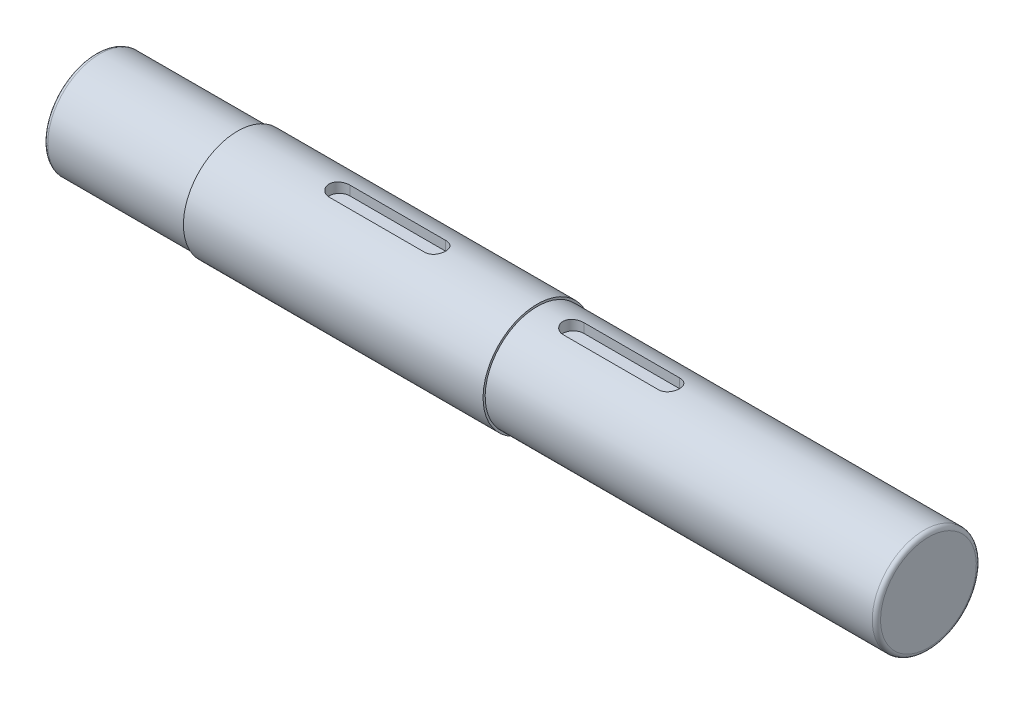
ISO-10303-21;
HEADER;
FILE_DESCRIPTION(('STEP AP214'),'2;1');
FILE_NAME('part.step','',(''),(''),'','','');
FILE_SCHEMA(('AUTOMOTIVE_DESIGN { 1 0 10303 214 1 1 1 1 }'));
ENDSEC;
DATA;
#1=APPLICATION_CONTEXT('core data for automotive mechanical design processes');
#2=APPLICATION_PROTOCOL_DEFINITION('international standard','automotive_design',2000,#1);
#3=PRODUCT_CONTEXT('',#1,'mechanical');
#4=PRODUCT('Part','Part','',(#3));
#5=PRODUCT_RELATED_PRODUCT_CATEGORY('part','',(#4));
#6=PRODUCT_DEFINITION_FORMATION('','',#4);
#7=PRODUCT_DEFINITION_CONTEXT('part definition',#1,'design');
#8=PRODUCT_DEFINITION('design','',#6,#7);
#9=PRODUCT_DEFINITION_SHAPE('','',#8);
#10=(LENGTH_UNIT() NAMED_UNIT(*) SI_UNIT(.MILLI.,.METRE.));
#11=(NAMED_UNIT(*) PLANE_ANGLE_UNIT() SI_UNIT($,.RADIAN.));
#12=(NAMED_UNIT(*) SI_UNIT($,.STERADIAN.) SOLID_ANGLE_UNIT());
#13=UNCERTAINTY_MEASURE_WITH_UNIT(LENGTH_MEASURE(1.E-05),#10,'distance_accuracy_value','');
#14=(GEOMETRIC_REPRESENTATION_CONTEXT(3) GLOBAL_UNCERTAINTY_ASSIGNED_CONTEXT((#13)) GLOBAL_UNIT_ASSIGNED_CONTEXT((#10,
#11,#12)) REPRESENTATION_CONTEXT('',''));
#15=CARTESIAN_POINT('',(0.,0.,0.));
#16=DIRECTION('',(0.,0.,1.));
#17=DIRECTION('',(1.,0.,0.));
#18=AXIS2_PLACEMENT_3D('',#15,#16,#17);
#19=CARTESIAN_POINT('',(111.690273614941,0.,0.));
#20=DIRECTION('',(-1.,0.,0.));
#21=DIRECTION('',(0.,-1.,0.));
#22=AXIS2_PLACEMENT_3D('',#19,#20,#21);
#23=PLANE('',#22);
#24=CARTESIAN_POINT('',(111.690273614941,0.,0.));
#25=DIRECTION('',(-1.,0.,0.));
#26=DIRECTION('',(0.,-1.,0.));
#27=AXIS2_PLACEMENT_3D('',#24,#25,#26);
#28=CIRCLE('',#27,11.5);
#29=CARTESIAN_POINT('',(111.690273614941,-11.5,0.));
#30=VERTEX_POINT('',#29);
#31=EDGE_CURVE('E258',#30,#30,#28,.F.);
#32=ORIENTED_EDGE('',*,*,#31,.T.);
#33=EDGE_LOOP('',(#32));
#34=FACE_BOUND('',#33,.T.);
#35=ADVANCED_FACE('F41',(#34),#23,.F.);
#36=CARTESIAN_POINT('',(-88.4097263850591,0.,0.));
#37=DIRECTION('',(-1.,0.,0.));
#38=DIRECTION('',(0.,-1.,0.));
#39=AXIS2_PLACEMENT_3D('',#36,#37,#38);
#40=CYLINDRICAL_SURFACE('',#39,12.5);
#41=CARTESIAN_POINT('',(110.690273614941,0.,0.));
#42=DIRECTION('',(-1.,0.,0.));
#43=DIRECTION('',(0.,-1.,0.));
#44=AXIS2_PLACEMENT_3D('',#41,#42,#43);
#45=CIRCLE('',#44,12.5);
#46=CARTESIAN_POINT('',(110.690273614941,-12.5,0.));
#47=VERTEX_POINT('',#46);
#48=EDGE_CURVE('E260',#47,#47,#45,.T.);
#49=ORIENTED_EDGE('',*,*,#48,.T.);
#50=EDGE_LOOP('',(#49));
#51=FACE_BOUND('',#50,.T.);
#52=DIRECTION('',(-1.,0.,0.));
#53=VECTOR('',#52,1.);
#54=CARTESIAN_POINT('',(-88.4097263850591,12.2474487139159,-2.5));
#55=LINE('',#54,#53);
#56=CARTESIAN_POINT('',(26.3902736149409,12.2474487139159,-2.5));
#57=VERTEX_POINT('',#56);
#58=CARTESIAN_POINT('',(49.3902736149409,12.2474487139159,-2.5));
#59=VERTEX_POINT('',#58);
#60=EDGE_CURVE('E266',#57,#59,#55,.F.);
#61=ORIENTED_EDGE('',*,*,#60,.T.);
#62=CARTESIAN_POINT('',(49.3902736149409,12.2474487139159,-2.5));
#63=CARTESIAN_POINT('',(49.4598376220897,12.2474426870481,-2.50000755272741));
#64=CARTESIAN_POINT('',(49.5293974568256,12.2480412546813,-2.49709659553059));
#65=CARTESIAN_POINT('',(49.6680053649151,12.2504029528616,-2.48549624534853));
#66=CARTESIAN_POINT('',(49.737053500508,12.2521659393457,-2.47680756718743));
#67=CARTESIAN_POINT('',(49.8740478615931,12.2568083390401,-2.45372788482215));
#68=CARTESIAN_POINT('',(49.9419956023545,12.259686051341,-2.43934556755123));
#69=CARTESIAN_POINT('',(50.0763956255271,12.2664685140533,-2.40500601307056));
#70=CARTESIAN_POINT('',(50.1428479018323,12.2703732686573,-2.38504875310239));
#71=CARTESIAN_POINT('',(50.33927836962,12.2834692504436,-2.31701273293409));
#72=CARTESIAN_POINT('',(50.466438663238,12.2940461363477,-2.26075131705719));
#73=CARTESIAN_POINT('',(50.7094631005628,12.3176934066007,-2.12812970933266));
#74=CARTESIAN_POINT('',(50.8253260717857,12.3307640493469,-2.05176743436921));
#75=CARTESIAN_POINT('',(51.0441657632378,12.3581317705242,-1.87995278838547));
#76=CARTESIAN_POINT('',(51.1469623253434,12.3724421926958,-1.78427266064758));
#77=CARTESIAN_POINT('',(51.3351617086396,12.4005606698654,-1.57702607132327));
#78=CARTESIAN_POINT('',(51.4205618348337,12.4143686467546,-1.46545715284151));
#79=CARTESIAN_POINT('',(51.5722453257628,12.4400702526806,-1.22840024371411));
#80=CARTESIAN_POINT('',(51.6383558929549,12.4519461799056,-1.10279959145392));
#81=CARTESIAN_POINT('',(51.7484634713106,12.4722938885068,-0.842002975760174));
#82=CARTESIAN_POINT('',(51.7924637534416,12.4807661733763,-0.706808435013479));
#83=CARTESIAN_POINT('',(51.8565411980104,12.4932579438613,-0.43254352997313));
#84=CARTESIAN_POINT('',(51.8769255784462,12.4973345628876,-0.293547588516978));
#85=CARTESIAN_POINT('',(51.8941510737405,12.5007730438039,-0.0140496897959967));
#86=CARTESIAN_POINT('',(51.8909939111029,12.5001352506414,0.126452156532592));
#87=CARTESIAN_POINT('',(51.8614581113347,12.494260861056,0.402855506346816));
#88=CARTESIAN_POINT('',(51.8354109894615,12.4890899207822,0.53879403324703));
#89=CARTESIAN_POINT('',(51.7613606732183,12.4748043625546,0.804330016531254));
#90=CARTESIAN_POINT('',(51.7133567608281,12.4656896156329,0.933927265392429));
#91=CARTESIAN_POINT('',(51.5964476060085,12.4444322280103,1.1840506782429));
#92=CARTESIAN_POINT('',(51.527412147574,12.4322708097767,1.30451431703059));
#93=CARTESIAN_POINT('',(51.3704979393012,12.4062612907301,1.53226609471824));
#94=CARTESIAN_POINT('',(51.2826176278456,12.3924130501763,1.63955314055331));
#95=CARTESIAN_POINT('',(51.0887027108635,12.3642759342124,1.83986551634352));
#96=CARTESIAN_POINT('',(50.9823801097582,12.3499835810435,1.93261173748932));
#97=CARTESIAN_POINT('',(50.7555117187225,12.3227926529107,2.09902724974939));
#98=CARTESIAN_POINT('',(50.6349620020263,12.3098944646352,2.17269125605403));
#99=CARTESIAN_POINT('',(50.3826426025751,12.286943251058,2.29894988661171));
#100=CARTESIAN_POINT('',(50.2508435564492,12.2768979874587,2.35148719158619));
#101=CARTESIAN_POINT('',(49.980127036802,12.2609040265624,2.43351774332483));
#102=CARTESIAN_POINT('',(49.8412204983206,12.2549492282072,2.46304531871083));
#103=CARTESIAN_POINT('',(49.6493815728248,12.2500794297991,2.48708234530491));
#104=CARTESIAN_POINT('',(49.5976382654848,12.2490939967999,2.49192813913878));
#105=CARTESIAN_POINT('',(49.4940289545973,12.2477791846693,2.49838291166163));
#106=CARTESIAN_POINT('',(49.4421633025514,12.2474487076206,2.49999730726164));
#107=CARTESIAN_POINT('',(49.3902736149409,12.2474487139159,2.5));
#108=B_SPLINE_CURVE_WITH_KNOTS('',3,(#62,#63,#64,#65,#66,#67,#68,#69,#70,#71,#72,#73,#74,#75,
#76,#77,#78,#79,#80,#81,#82,#83,#84,#85,#86,#87,#88,#89,#90,#91,#92,#93,#94,#95,#96,#97,#98,#99,
#100,#101,#102,#103,#104,#105,#106,#107),.UNSPECIFIED.,.F.,.F.,(4,2,2,2,2,2,2,2,2,2,2,2,2,2,2,2,
2,2,2,2,2,2,4),(0.,0.208621275894793,0.417216745803832,0.625495175236966,0.833774454931102,
1.25000691135223,1.66628252025786,2.08778731527755,2.50935735880446,2.93459542557449,
3.35977056463055,3.77935021287091,4.19889916132035,4.61247011057753,5.02605458519858,
5.44225366753896,5.85848725240715,6.28192795775071,6.70548580970531,7.13018519486865,
7.55424974394837,7.71010621722896,7.86570120305829),.UNSPECIFIED.);
#109=CARTESIAN_POINT('',(49.3902736149409,12.2474487139159,2.5));
#110=VERTEX_POINT('',#109);
#111=EDGE_CURVE('E172',#59,#110,#108,.T.);
#112=ORIENTED_EDGE('',*,*,#111,.T.);
#113=DIRECTION('',(-1.,0.,0.));
#114=VECTOR('',#113,1.);
#115=CARTESIAN_POINT('',(-88.4097263850591,12.2474487139159,2.5));
#116=LINE('',#115,#114);
#117=CARTESIAN_POINT('',(26.3902736149409,12.2474487139159,2.5));
#118=VERTEX_POINT('',#117);
#119=EDGE_CURVE('E405',#110,#118,#116,.T.);
#120=ORIENTED_EDGE('',*,*,#119,.T.);
#121=CARTESIAN_POINT('',(26.3902736149409,12.2474487139159,2.5));
#122=CARTESIAN_POINT('',(26.3207096077921,12.2474426870481,2.50000755272741));
#123=CARTESIAN_POINT('',(26.2511497730561,12.2480412546813,2.4970965955306));
#124=CARTESIAN_POINT('',(26.1125418649667,12.2504029528616,2.48549624534853));
#125=CARTESIAN_POINT('',(26.0434937293738,12.2521659393457,2.47680756718743));
#126=CARTESIAN_POINT('',(25.9064993682887,12.2568083390401,2.45372788482214));
#127=CARTESIAN_POINT('',(25.8385516275273,12.259686051341,2.43934556755123));
#128=CARTESIAN_POINT('',(25.7041516043547,12.2664685140533,2.40500601307056));
#129=CARTESIAN_POINT('',(25.6376993280495,12.2703732686573,2.38504875310239));
#130=CARTESIAN_POINT('',(25.4412688602617,12.2834692504436,2.31701273293409));
#131=CARTESIAN_POINT('',(25.3141085666438,12.2940461363477,2.26075131705718));
#132=CARTESIAN_POINT('',(25.071084129319,12.3176934066007,2.12812970933265));
#133=CARTESIAN_POINT('',(24.955221158096,12.3307640493469,2.0517674343692));
#134=CARTESIAN_POINT('',(24.736381466644,12.3581317705242,1.87995278838546));
#135=CARTESIAN_POINT('',(24.6335849045384,12.3724421926958,1.78427266064757));
#136=CARTESIAN_POINT('',(24.4453855212422,12.4005606698654,1.57702607132326));
#137=CARTESIAN_POINT('',(24.3599853950481,12.4143686467546,1.46545715284151));
#138=CARTESIAN_POINT('',(24.2083019041189,12.4400702526806,1.2284002437141));
#139=CARTESIAN_POINT('',(24.1421913369268,12.4519461799056,1.10279959145392));
#140=CARTESIAN_POINT('',(24.0320837585712,12.4722938885068,0.842002975760171));
#141=CARTESIAN_POINT('',(23.9880834764402,12.4807661733763,0.706808435013478));
#142=CARTESIAN_POINT('',(23.9240060318714,12.4932579438613,0.43254352997313));
#143=CARTESIAN_POINT('',(23.9036216514356,12.4973345628876,0.293547588516977));
#144=CARTESIAN_POINT('',(23.8863961561412,12.5007730438039,0.0140496897959932));
#145=CARTESIAN_POINT('',(23.8895533187789,12.5001352506414,-0.126452156532596));
#146=CARTESIAN_POINT('',(23.9190891185471,12.494260861056,-0.402855506346822));
#147=CARTESIAN_POINT('',(23.9451362404203,12.4890899207822,-0.538794033247035));
#148=CARTESIAN_POINT('',(24.0191865566635,12.4748043625546,-0.804330016531258));
#149=CARTESIAN_POINT('',(24.0671904690537,12.4656896156329,-0.933927265392434));
#150=CARTESIAN_POINT('',(24.1840996238733,12.4444322280103,-1.1840506782429));
#151=CARTESIAN_POINT('',(24.2531350823078,12.4322708097767,-1.30451431703059));
#152=CARTESIAN_POINT('',(24.4100492905806,12.4062612907301,-1.53226609471824));
#153=CARTESIAN_POINT('',(24.4979296020362,12.3924130501763,-1.63955314055331));
#154=CARTESIAN_POINT('',(24.6918445190182,12.3642759342124,-1.83986551634353));
#155=CARTESIAN_POINT('',(24.7981671201236,12.3499835810435,-1.93261173748932));
#156=CARTESIAN_POINT('',(25.0250355111593,12.3227926529107,-2.0990272497494));
#157=CARTESIAN_POINT('',(25.1455852278555,12.3098944646352,-2.17269125605403));
#158=CARTESIAN_POINT('',(25.3979046273067,12.286943251058,-2.29894988661171));
#159=CARTESIAN_POINT('',(25.5297036734326,12.2768979874587,-2.3514871915862));
#160=CARTESIAN_POINT('',(25.8004201930798,12.2609040265624,-2.43351774332483));
#161=CARTESIAN_POINT('',(25.9393267315612,12.2549492282072,-2.46304531871083));
#162=CARTESIAN_POINT('',(26.131165657057,12.2500794297991,-2.48708234530491));
#163=CARTESIAN_POINT('',(26.182908964397,12.2490939967999,-2.49192813913878));
#164=CARTESIAN_POINT('',(26.2865182752844,12.2477791846693,-2.49838291166163));
#165=CARTESIAN_POINT('',(26.3383839273303,12.2474487076206,-2.49999730726164));
#166=CARTESIAN_POINT('',(26.3902736149409,12.2474487139159,-2.5));
#167=B_SPLINE_CURVE_WITH_KNOTS('',3,(#121,#122,#123,#124,#125,#126,#127,#128,#129,#130,#131,
#132,#133,#134,#135,#136,#137,#138,#139,#140,#141,#142,#143,#144,#145,#146,#147,#148,#149,#150,
#151,#152,#153,#154,#155,#156,#157,#158,#159,#160,#161,#162,#163,#164,#165,#166),.UNSPECIFIED.,
.F.,.F.,(4,2,2,2,2,2,2,2,2,2,2,2,2,2,2,2,2,2,2,2,2,2,4),(0.,0.208621275894803,0.417216745803839,
0.62549517523698,0.833774454931106,1.25000691135225,1.66628252025787,2.08778731527756,
2.50935735880446,2.93459542557449,3.35977056463055,3.77935021287091,4.19889916132035,
4.61247011057754,5.02605458519858,5.44225366753897,5.85848725240716,6.28192795775072,
6.70548580970531,7.13018519486867,7.55424974394838,7.71010621722896,7.86570120305829),.UNSPECIFIED.);
#168=EDGE_CURVE('E64',#118,#57,#167,.T.);
#169=ORIENTED_EDGE('',*,*,#168,.T.);
#170=EDGE_LOOP('',(#61,#112,#120,#169));
#171=FACE_BOUND('',#170,.T.);
#172=CARTESIAN_POINT('',(17.6902736149409,0.,0.));
#173=DIRECTION('',(-1.,0.,0.));
#174=DIRECTION('',(0.,-1.,0.));
#175=AXIS2_PLACEMENT_3D('',#172,#173,#174);
#176=CIRCLE('',#175,12.5);
#177=CARTESIAN_POINT('',(17.6902736149409,-12.5,0.));
#178=VERTEX_POINT('',#177);
#179=EDGE_CURVE('E169',#178,#178,#176,.T.);
#180=ORIENTED_EDGE('',*,*,#179,.F.);
#181=EDGE_LOOP('',(#180));
#182=FACE_BOUND('',#181,.T.);
#183=ADVANCED_FACE('F187',(#51,#171,#182),#40,.T.);
#184=CARTESIAN_POINT('',(17.6902736149409,12.5,0.));
#185=DIRECTION('',(-1.,0.,0.));
#186=DIRECTION('',(0.,-1.,0.));
#187=AXIS2_PLACEMENT_3D('',#184,#185,#186);
#188=PLANE('',#187);
#189=CARTESIAN_POINT('',(17.6902736149409,0.,0.));
#190=DIRECTION('',(-1.,0.,0.));
#191=DIRECTION('',(0.,-1.,0.));
#192=AXIS2_PLACEMENT_3D('',#189,#190,#191);
#193=CIRCLE('',#192,13.);
#194=CARTESIAN_POINT('',(17.6902736149409,-13.,0.));
#195=VERTEX_POINT('',#194);
#196=EDGE_CURVE('E166',#195,#195,#193,.T.);
#197=ORIENTED_EDGE('',*,*,#196,.F.);
#198=EDGE_LOOP('',(#197));
#199=FACE_BOUND('',#198,.T.);
#200=ORIENTED_EDGE('',*,*,#179,.T.);
#201=EDGE_LOOP('',(#200));
#202=FACE_BOUND('',#201,.T.);
#203=ADVANCED_FACE('F222',(#199,#202),#188,.F.);
#204=CARTESIAN_POINT('',(-88.4097263850591,0.,0.));
#205=DIRECTION('',(-1.,0.,0.));
#206=DIRECTION('',(0.,-1.,0.));
#207=AXIS2_PLACEMENT_3D('',#204,#205,#206);
#208=CYLINDRICAL_SURFACE('',#207,13.);
#209=DIRECTION('',(-1.,0.,0.));
#210=VECTOR('',#209,1.);
#211=CARTESIAN_POINT('',(-88.4097263850591,12.7573508221731,-2.5));
#212=LINE('',#211,#210);
#213=CARTESIAN_POINT('',(-29.8097263850591,12.7573508221731,-2.5));
#214=VERTEX_POINT('',#213);
#215=CARTESIAN_POINT('',(-6.8097263850591,12.7573508221731,-2.5));
#216=VERTEX_POINT('',#215);
#217=EDGE_CURVE('E11',#214,#216,#212,.F.);
#218=ORIENTED_EDGE('',*,*,#217,.T.);
#219=CARTESIAN_POINT('',(-6.8097263850591,12.7573508221731,-2.5));
#220=CARTESIAN_POINT('',(-6.74010543003731,12.7573450464474,-2.50000749134501));
#221=CARTESIAN_POINT('',(-6.67048857150002,12.7579206121242,-2.49709183508114));
#222=CARTESIAN_POINT('',(-6.5317659348348,12.7601916690976,-2.4854723251681));
#223=CARTESIAN_POINT('',(-6.46266009745244,12.7618870284246,-2.47676915358704));
#224=CARTESIAN_POINT('',(-6.3255458183286,12.7663516758934,-2.45364955850212));
#225=CARTESIAN_POINT('',(-6.25753592298227,12.7691193940352,-2.43924148665357));
#226=CARTESIAN_POINT('',(-6.12301202324146,12.7756429882,-2.40483890464578));
#227=CARTESIAN_POINT('',(-6.05649802305999,12.7793988670055,-2.38484437875512));
#228=CARTESIAN_POINT('',(-5.85988060341373,12.7919965449688,-2.31667689058028));
#229=CARTESIAN_POINT('',(-5.73259707564685,12.802172039726,-2.26030223128797));
#230=CARTESIAN_POINT('',(-5.48935051334008,12.8249236030346,-2.12740433500017));
#231=CARTESIAN_POINT('',(-5.37338840078856,12.8374998668528,-2.05087945889333));
#232=CARTESIAN_POINT('',(-5.15449564680986,12.8638190772355,-1.87877766486924));
#233=CARTESIAN_POINT('',(-5.05173192728085,12.8775738735689,-1.78298987237361));
#234=CARTESIAN_POINT('',(-4.86362479268248,12.9045968562288,-1.57553248923086));
#235=CARTESIAN_POINT('',(-4.7782840684775,12.9178649671309,-1.46386044988071));
#236=CARTESIAN_POINT('',(-4.6268012858562,12.9425467094166,-1.22669868693375));
#237=CARTESIAN_POINT('',(-4.56081859778045,12.9539446237223,-1.10110538216146));
#238=CARTESIAN_POINT('',(-4.4509574251215,12.9734672220131,-0.840366995812638));
#239=CARTESIAN_POINT('',(-4.40707581404358,12.9815923689427,-0.70522326835801));
#240=CARTESIAN_POINT('',(-4.34317938370731,12.9935704801327,-0.430962451712164));
#241=CARTESIAN_POINT('',(-4.32288009102498,12.9974743252764,-0.29191389808188));
#242=CARTESIAN_POINT('',(-4.30583771993343,13.0007455259619,-0.0123303588048953));
#243=CARTESIAN_POINT('',(-4.30909308550964,13.0001131811632,0.12820452804261));
#244=CARTESIAN_POINT('',(-4.33885119945305,12.9944227132966,0.404812069674784));
#245=CARTESIAN_POINT('',(-4.36504699575083,12.9894230291797,0.540919123573041));
#246=CARTESIAN_POINT('',(-4.43945619046678,12.9756253916883,0.80676797091447));
#247=CARTESIAN_POINT('',(-4.48767026575773,12.9668273215464,0.936509568538793));
#248=CARTESIAN_POINT('',(-4.60503761500514,12.9463241531854,1.18683246539346));
#249=CARTESIAN_POINT('',(-4.67431301156202,12.9346021740292,1.30735506625151));
#250=CARTESIAN_POINT('',(-4.83174427938713,12.9095465327852,1.53517508001959));
#251=CARTESIAN_POINT('',(-4.91990153550125,12.8962127525149,1.642471521978));
#252=CARTESIAN_POINT('',(-5.11426950606671,12.8691563183537,1.84260520934155));
#253=CARTESIAN_POINT('',(-5.22074664534721,12.8554308562756,1.93518347788428));
#254=CARTESIAN_POINT('',(-5.44788680430101,12.8293376783619,2.10123391086704));
#255=CARTESIAN_POINT('',(-5.5685537629608,12.8169703413828,2.17470075185363));
#256=CARTESIAN_POINT('',(-5.82102006500621,12.7949870228682,2.30052439071487));
#257=CARTESIAN_POINT('',(-5.95284560943516,12.7853777633391,2.35282973848041));
#258=CARTESIAN_POINT('',(-6.2235538727421,12.7700991944559,2.43440300782316));
#259=CARTESIAN_POINT('',(-6.36242574217886,12.7644240140795,2.46370526675116));
#260=CARTESIAN_POINT('',(-6.55361687329827,12.7598182513312,2.48738033750851));
#261=CARTESIAN_POINT('',(-6.60476477995395,12.758893934206,2.49211443610511));
#262=CARTESIAN_POINT('',(-6.70717628789199,12.7576607600124,2.4984202631732));
#263=CARTESIAN_POINT('',(-6.75843955011286,12.7573508708674,2.49999729472618));
#264=CARTESIAN_POINT('',(-6.8097263850591,12.7573508221731,2.5));
#265=B_SPLINE_CURVE_WITH_KNOTS('',3,(#219,#220,#221,#222,#223,#224,#225,#226,#227,#228,#229,
#230,#231,#232,#233,#234,#235,#236,#237,#238,#239,#240,#241,#242,#243,#244,#245,#246,#247,#248,
#249,#250,#251,#252,#253,#254,#255,#256,#257,#258,#259,#260,#261,#262,#263,#264),.UNSPECIFIED.,
.F.,.F.,(4,2,2,2,2,2,2,2,2,2,2,2,2,2,2,2,2,2,2,2,2,2,4),(0.,0.208792287301755,0.417559972452479,
0.626023156699722,0.834486927984083,1.25109972457767,1.667746420848,2.08923027242979,
2.51077917019385,2.93570700224004,3.36057470563138,3.78026219322586,4.19992195662793,
4.61405085494291,5.02819248501802,5.44478282994126,5.86140373917902,6.28469435084244,
6.70810274338997,7.1325344735811,7.55633143158241,7.71037872823123,7.86416704617294),.UNSPECIFIED.);
#266=CARTESIAN_POINT('',(-6.8097263850591,12.7573508221731,2.5));
#267=VERTEX_POINT('',#266);
#268=EDGE_CURVE('E226',#216,#267,#265,.T.);
#269=ORIENTED_EDGE('',*,*,#268,.T.);
#270=DIRECTION('',(-1.,0.,0.));
#271=VECTOR('',#270,1.);
#272=CARTESIAN_POINT('',(-88.4097263850591,12.7573508221731,2.5));
#273=LINE('',#272,#271);
#274=CARTESIAN_POINT('',(-29.8097263850591,12.7573508221731,2.5));
#275=VERTEX_POINT('',#274);
#276=EDGE_CURVE('E49',#267,#275,#273,.T.);
#277=ORIENTED_EDGE('',*,*,#276,.T.);
#278=CARTESIAN_POINT('',(-29.8097263850591,12.7573508221731,2.5));
#279=CARTESIAN_POINT('',(-29.8793473400809,12.7573450464474,2.50000749134502));
#280=CARTESIAN_POINT('',(-29.9489641986182,12.7579206121242,2.49709183508114));
#281=CARTESIAN_POINT('',(-30.0876868352834,12.7601916690976,2.4854723251681));
#282=CARTESIAN_POINT('',(-30.1567926726658,12.7618870284246,2.47676915358705));
#283=CARTESIAN_POINT('',(-30.2939069517896,12.7663516758934,2.45364955850212));
#284=CARTESIAN_POINT('',(-30.3619168471359,12.7691193940352,2.43924148665357));
#285=CARTESIAN_POINT('',(-30.4964407468767,12.7756429882,2.40483890464578));
#286=CARTESIAN_POINT('',(-30.5629547470582,12.7793988670055,2.38484437875512));
#287=CARTESIAN_POINT('',(-30.7595721667045,12.7919965449688,2.31667689058028));
#288=CARTESIAN_POINT('',(-30.8868556944713,12.802172039726,2.26030223128797));
#289=CARTESIAN_POINT('',(-31.1301022567781,12.8249236030346,2.12740433500018));
#290=CARTESIAN_POINT('',(-31.2460643693296,12.8374998668528,2.05087945889334));
#291=CARTESIAN_POINT('',(-31.4649571233083,12.8638190772355,1.87877766486925));
#292=CARTESIAN_POINT('',(-31.5677208428373,12.8775738735689,1.78298987237362));
#293=CARTESIAN_POINT('',(-31.7558279774357,12.9045968562288,1.57553248923087));
#294=CARTESIAN_POINT('',(-31.8411687016407,12.9178649671309,1.46386044988071));
#295=CARTESIAN_POINT('',(-31.992651484262,12.9425467094166,1.22669868693376));
#296=CARTESIAN_POINT('',(-32.0586341723377,12.9539446237223,1.10110538216147));
#297=CARTESIAN_POINT('',(-32.1684953449967,12.9734672220131,0.840366995812644));
#298=CARTESIAN_POINT('',(-32.2123769560746,12.9815923689427,0.705223268358016));
#299=CARTESIAN_POINT('',(-32.2762733864109,12.9935704801327,0.43096245171217));
#300=CARTESIAN_POINT('',(-32.2965726790932,12.9974743252764,0.291913898081886));
#301=CARTESIAN_POINT('',(-32.3136150501848,13.0007455259619,0.0123303588049004));
#302=CARTESIAN_POINT('',(-32.3103596846086,13.0001131811632,-0.128204528042606));
#303=CARTESIAN_POINT('',(-32.2806015706651,12.9944227132966,-0.40481206967478));
#304=CARTESIAN_POINT('',(-32.2544057743674,12.9894230291797,-0.540919123573037));
#305=CARTESIAN_POINT('',(-32.1799965796514,12.9756253916883,-0.806767970914466));
#306=CARTESIAN_POINT('',(-32.1317825043605,12.9668273215464,-0.936509568538789));
#307=CARTESIAN_POINT('',(-32.0144151551131,12.9463241531854,-1.18683246539346));
#308=CARTESIAN_POINT('',(-31.9451397585562,12.9346021740292,-1.30735506625151));
#309=CARTESIAN_POINT('',(-31.7877084907311,12.9095465327852,-1.53517508001959));
#310=CARTESIAN_POINT('',(-31.6995512346169,12.8962127525149,-1.642471521978));
#311=CARTESIAN_POINT('',(-31.5051832640515,12.8691563183537,-1.84260520934154));
#312=CARTESIAN_POINT('',(-31.398706124771,12.8554308562756,-1.93518347788428));
#313=CARTESIAN_POINT('',(-31.1715659658172,12.8293376783619,-2.10123391086704));
#314=CARTESIAN_POINT('',(-31.0508990071574,12.8169703413828,-2.17470075185362));
#315=CARTESIAN_POINT('',(-30.798432705112,12.7949870228682,-2.30052439071486));
#316=CARTESIAN_POINT('',(-30.666607160683,12.7853777633391,-2.3528297384804));
#317=CARTESIAN_POINT('',(-30.3958988973761,12.7700991944559,-2.43440300782316));
#318=CARTESIAN_POINT('',(-30.2570270279393,12.7644240140795,-2.46370526675116));
#319=CARTESIAN_POINT('',(-30.0658358968199,12.7598182513312,-2.4873803375085));
#320=CARTESIAN_POINT('',(-30.0146879901642,12.758893934206,-2.4921144361051));
#321=CARTESIAN_POINT('',(-29.9122764822262,12.7576607600124,-2.49842026317319));
#322=CARTESIAN_POINT('',(-29.8610132200053,12.7573508708674,-2.49999729472618));
#323=CARTESIAN_POINT('',(-29.8097263850591,12.7573508221731,-2.5));
#324=B_SPLINE_CURVE_WITH_KNOTS('',3,(#278,#279,#280,#281,#282,#283,#284,#285,#286,#287,#288,
#289,#290,#291,#292,#293,#294,#295,#296,#297,#298,#299,#300,#301,#302,#303,#304,#305,#306,#307,
#308,#309,#310,#311,#312,#313,#314,#315,#316,#317,#318,#319,#320,#321,#322,#323),.UNSPECIFIED.,
.F.,.F.,(4,2,2,2,2,2,2,2,2,2,2,2,2,2,2,2,2,2,2,2,2,2,4),(0.,0.20879228730175,0.417559972452476,
0.626023156699716,0.834486927984083,1.25109972457767,1.667746420848,2.08923027242979,
2.51077917019385,2.93570700224004,3.36057470563138,3.78026219322586,4.19992195662793,
4.61405085494291,5.02819248501802,5.44478282994126,5.86140373917903,6.28469435084244,
6.70810274338997,7.1325344735811,7.55633143158241,7.71037872823123,7.86416704617294),.UNSPECIFIED.);
#325=EDGE_CURVE('E56',#275,#214,#324,.T.);
#326=ORIENTED_EDGE('',*,*,#325,.T.);
#327=EDGE_LOOP('',(#218,#269,#277,#326));
#328=FACE_BOUND('',#327,.T.);
#329=CARTESIAN_POINT('',(-54.3097263850591,0.,0.));
#330=DIRECTION('',(-1.,0.,0.));
#331=DIRECTION('',(0.,-1.,0.));
#332=AXIS2_PLACEMENT_3D('',#329,#330,#331);
#333=CIRCLE('',#332,13.);
#334=CARTESIAN_POINT('',(-54.3097263850591,-13.,0.));
#335=VERTEX_POINT('',#334);
#336=EDGE_CURVE('E163',#335,#335,#333,.T.);
#337=ORIENTED_EDGE('',*,*,#336,.F.);
#338=EDGE_LOOP('',(#337));
#339=FACE_BOUND('',#338,.T.);
#340=ORIENTED_EDGE('',*,*,#196,.T.);
#341=EDGE_LOOP('',(#340));
#342=FACE_BOUND('',#341,.T.);
#343=ADVANCED_FACE('F218',(#328,#339,#342),#208,.T.);
#344=CARTESIAN_POINT('',(-54.3097263850591,13.,0.));
#345=DIRECTION('',(1.,0.,0.));
#346=DIRECTION('',(0.,1.,0.));
#347=AXIS2_PLACEMENT_3D('',#344,#345,#346);
#348=PLANE('',#347);
#349=CARTESIAN_POINT('',(-54.3097263850591,0.,0.));
#350=DIRECTION('',(-1.,0.,0.));
#351=DIRECTION('',(0.,-1.,0.));
#352=AXIS2_PLACEMENT_3D('',#349,#350,#351);
#353=CIRCLE('',#352,12.5);
#354=CARTESIAN_POINT('',(-54.3097263850591,-12.5,0.));
#355=VERTEX_POINT('',#354);
#356=EDGE_CURVE('E153',#355,#355,#353,.T.);
#357=ORIENTED_EDGE('',*,*,#356,.F.);
#358=EDGE_LOOP('',(#357));
#359=FACE_BOUND('',#358,.T.);
#360=ORIENTED_EDGE('',*,*,#336,.T.);
#361=EDGE_LOOP('',(#360));
#362=FACE_BOUND('',#361,.T.);
#363=ADVANCED_FACE('F214',(#359,#362),#348,.F.);
#364=CARTESIAN_POINT('',(-88.4097263850591,0.,0.));
#365=DIRECTION('',(-1.,0.,0.));
#366=DIRECTION('',(0.,-1.,0.));
#367=AXIS2_PLACEMENT_3D('',#364,#365,#366);
#368=CYLINDRICAL_SURFACE('',#367,12.5);
#369=CARTESIAN_POINT('',(-87.4097263850591,0.,0.));
#370=DIRECTION('',(1.,0.,0.));
#371=DIRECTION('',(0.,1.,0.));
#372=AXIS2_PLACEMENT_3D('',#369,#370,#371);
#373=CIRCLE('',#372,12.5);
#374=CARTESIAN_POINT('',(-87.4097263850591,12.5,0.));
#375=VERTEX_POINT('',#374);
#376=EDGE_CURVE('E263',#375,#375,#373,.T.);
#377=ORIENTED_EDGE('',*,*,#376,.T.);
#378=EDGE_LOOP('',(#377));
#379=FACE_BOUND('',#378,.T.);
#380=ORIENTED_EDGE('',*,*,#356,.T.);
#381=EDGE_LOOP('',(#380));
#382=FACE_BOUND('',#381,.T.);
#383=ADVANCED_FACE('F210',(#379,#382),#368,.T.);
#384=CARTESIAN_POINT('',(-88.4097263850591,12.5,0.));
#385=DIRECTION('',(1.,0.,0.));
#386=DIRECTION('',(0.,1.,0.));
#387=AXIS2_PLACEMENT_3D('',#384,#385,#386);
#388=PLANE('',#387);
#389=CARTESIAN_POINT('',(-88.4097263850591,0.,0.));
#390=DIRECTION('',(1.,0.,0.));
#391=DIRECTION('',(0.,1.,0.));
#392=AXIS2_PLACEMENT_3D('',#389,#390,#391);
#393=CIRCLE('',#392,11.5);
#394=CARTESIAN_POINT('',(-88.4097263850591,11.5,0.));
#395=VERTEX_POINT('',#394);
#396=EDGE_CURVE('E259',#395,#395,#393,.F.);
#397=ORIENTED_EDGE('',*,*,#396,.T.);
#398=EDGE_LOOP('',(#397));
#399=FACE_BOUND('',#398,.T.);
#400=ADVANCED_FACE('F207',(#399),#388,.F.);
#401=CARTESIAN_POINT('',(26.3902736149409,10.,0.));
#402=DIRECTION('',(0.,1.,0.));
#403=DIRECTION('',(-1.,0.,0.));
#404=AXIS2_PLACEMENT_3D('',#401,#402,#403);
#405=CYLINDRICAL_SURFACE('',#404,2.5);
#406=DIRECTION('',(0.,1.,0.));
#407=VECTOR('',#406,1.);
#408=CARTESIAN_POINT('',(26.3902736149409,10.,2.5));
#409=LINE('',#408,#407);
#410=CARTESIAN_POINT('',(26.3902736149409,10.,2.5));
#411=VERTEX_POINT('',#410);
#412=EDGE_CURVE('E150',#411,#118,#409,.T.);
#413=ORIENTED_EDGE('',*,*,#412,.F.);
#414=CARTESIAN_POINT('',(26.3902736149409,10.,0.));
#415=DIRECTION('',(0.,1.,0.));
#416=DIRECTION('',(-1.,0.,0.));
#417=AXIS2_PLACEMENT_3D('',#414,#415,#416);
#418=CIRCLE('',#417,2.5);
#419=CARTESIAN_POINT('',(26.3902736149409,10.,-2.5));
#420=VERTEX_POINT('',#419);
#421=EDGE_CURVE('E134',#420,#411,#418,.T.);
#422=ORIENTED_EDGE('',*,*,#421,.F.);
#423=DIRECTION('',(0.,1.,0.));
#424=VECTOR('',#423,1.);
#425=CARTESIAN_POINT('',(26.3902736149409,10.,-2.5));
#426=LINE('',#425,#424);
#427=EDGE_CURVE('E151',#420,#57,#426,.T.);
#428=ORIENTED_EDGE('',*,*,#427,.T.);
#429=ORIENTED_EDGE('',*,*,#168,.F.);
#430=EDGE_LOOP('',(#413,#422,#428,#429));
#431=FACE_BOUND('',#430,.T.);
#432=ADVANCED_FACE('F203',(#431),#405,.F.);
#433=CARTESIAN_POINT('',(26.3902736149409,10.,-2.5));
#434=DIRECTION('',(0.,0.,-1.));
#435=DIRECTION('',(-1.,0.,0.));
#436=AXIS2_PLACEMENT_3D('',#433,#434,#435);
#437=PLANE('',#436);
#438=ORIENTED_EDGE('',*,*,#427,.F.);
#439=DIRECTION('',(-1.,0.,0.));
#440=VECTOR('',#439,1.);
#441=CARTESIAN_POINT('',(26.3902736149409,10.,-2.5));
#442=LINE('',#441,#440);
#443=CARTESIAN_POINT('',(49.3902736149409,10.,-2.5));
#444=VERTEX_POINT('',#443);
#445=EDGE_CURVE('E147',#444,#420,#442,.T.);
#446=ORIENTED_EDGE('',*,*,#445,.F.);
#447=DIRECTION('',(0.,1.,0.));
#448=VECTOR('',#447,1.);
#449=CARTESIAN_POINT('',(49.3902736149409,10.,-2.5));
#450=LINE('',#449,#448);
#451=EDGE_CURVE('E154',#444,#59,#450,.T.);
#452=ORIENTED_EDGE('',*,*,#451,.T.);
#453=ORIENTED_EDGE('',*,*,#60,.F.);
#454=EDGE_LOOP('',(#438,#446,#452,#453));
#455=FACE_BOUND('',#454,.T.);
#456=ADVANCED_FACE('F197',(#455),#437,.F.);
#457=CARTESIAN_POINT('',(49.3902736149409,10.,0.));
#458=DIRECTION('',(0.,1.,0.));
#459=DIRECTION('',(-1.,0.,0.));
#460=AXIS2_PLACEMENT_3D('',#457,#458,#459);
#461=CYLINDRICAL_SURFACE('',#460,2.5);
#462=ORIENTED_EDGE('',*,*,#451,.F.);
#463=CARTESIAN_POINT('',(49.3902736149409,10.,0.));
#464=DIRECTION('',(0.,1.,0.));
#465=DIRECTION('',(-1.,0.,0.));
#466=AXIS2_PLACEMENT_3D('',#463,#464,#465);
#467=CIRCLE('',#466,2.5);
#468=CARTESIAN_POINT('',(49.3902736149409,10.,2.5));
#469=VERTEX_POINT('',#468);
#470=EDGE_CURVE('E144',#469,#444,#467,.T.);
#471=ORIENTED_EDGE('',*,*,#470,.F.);
#472=DIRECTION('',(0.,1.,0.));
#473=VECTOR('',#472,1.);
#474=CARTESIAN_POINT('',(49.3902736149409,10.,2.5));
#475=LINE('',#474,#473);
#476=EDGE_CURVE('E157',#469,#110,#475,.T.);
#477=ORIENTED_EDGE('',*,*,#476,.T.);
#478=ORIENTED_EDGE('',*,*,#111,.F.);
#479=EDGE_LOOP('',(#462,#471,#477,#478));
#480=FACE_BOUND('',#479,.T.);
#481=ADVANCED_FACE('F191',(#480),#461,.F.);
#482=CARTESIAN_POINT('',(26.3902736149409,10.,2.5));
#483=DIRECTION('',(0.,0.,1.));
#484=DIRECTION('',(1.,0.,0.));
#485=AXIS2_PLACEMENT_3D('',#482,#483,#484);
#486=PLANE('',#485);
#487=ORIENTED_EDGE('',*,*,#476,.F.);
#488=DIRECTION('',(1.,0.,0.));
#489=VECTOR('',#488,1.);
#490=CARTESIAN_POINT('',(26.3902736149409,10.,2.5));
#491=LINE('',#490,#489);
#492=EDGE_CURVE('E141',#411,#469,#491,.T.);
#493=ORIENTED_EDGE('',*,*,#492,.F.);
#494=ORIENTED_EDGE('',*,*,#412,.T.);
#495=ORIENTED_EDGE('',*,*,#119,.F.);
#496=EDGE_LOOP('',(#487,#493,#494,#495));
#497=FACE_BOUND('',#496,.T.);
#498=ADVANCED_FACE('F196',(#497),#486,.F.);
#499=CARTESIAN_POINT('',(26.3902736149409,10.,0.));
#500=DIRECTION('',(0.,1.,0.));
#501=DIRECTION('',(-1.,0.,0.));
#502=AXIS2_PLACEMENT_3D('',#499,#500,#501);
#503=PLANE('',#502);
#504=ORIENTED_EDGE('',*,*,#421,.T.);
#505=ORIENTED_EDGE('',*,*,#492,.T.);
#506=ORIENTED_EDGE('',*,*,#470,.T.);
#507=ORIENTED_EDGE('',*,*,#445,.T.);
#508=EDGE_LOOP('',(#504,#505,#506,#507));
#509=FACE_BOUND('',#508,.T.);
#510=ADVANCED_FACE('F201',(#509),#503,.T.);
#511=CARTESIAN_POINT('',(110.690273614941,0.,0.));
#512=DIRECTION('',(-1.,0.,0.));
#513=DIRECTION('',(0.,-1.,0.));
#514=AXIS2_PLACEMENT_3D('',#511,#512,#513);
#515=TOROIDAL_SURFACE('',#514,11.5,1.);
#516=ORIENTED_EDGE('',*,*,#31,.F.);
#517=EDGE_LOOP('',(#516));
#518=FACE_BOUND('',#517,.T.);
#519=ORIENTED_EDGE('',*,*,#48,.F.);
#520=EDGE_LOOP('',(#519));
#521=FACE_BOUND('',#520,.T.);
#522=ADVANCED_FACE('F244',(#518,#521),#515,.T.);
#523=CARTESIAN_POINT('',(-87.4097263850591,0.,0.));
#524=DIRECTION('',(1.,0.,0.));
#525=DIRECTION('',(0.,1.,0.));
#526=AXIS2_PLACEMENT_3D('',#523,#524,#525);
#527=TOROIDAL_SURFACE('',#526,11.5,1.);
#528=ORIENTED_EDGE('',*,*,#376,.F.);
#529=EDGE_LOOP('',(#528));
#530=FACE_BOUND('',#529,.T.);
#531=ORIENTED_EDGE('',*,*,#396,.F.);
#532=EDGE_LOOP('',(#531));
#533=FACE_BOUND('',#532,.T.);
#534=ADVANCED_FACE('F43',(#530,#533),#527,.T.);
#535=CARTESIAN_POINT('',(-29.8097263850591,10.5,0.));
#536=DIRECTION('',(0.,1.,0.));
#537=DIRECTION('',(0.,0.,1.));
#538=AXIS2_PLACEMENT_3D('',#535,#536,#537);
#539=CYLINDRICAL_SURFACE('',#538,2.5);
#540=DIRECTION('',(0.,1.,0.));
#541=VECTOR('',#540,1.);
#542=CARTESIAN_POINT('',(-29.8097263850591,10.5,2.5));
#543=LINE('',#542,#541);
#544=CARTESIAN_POINT('',(-29.8097263850591,10.5,2.5));
#545=VERTEX_POINT('',#544);
#546=EDGE_CURVE('E106',#545,#275,#543,.T.);
#547=ORIENTED_EDGE('',*,*,#546,.F.);
#548=CARTESIAN_POINT('',(-29.8097263850591,10.5,0.));
#549=DIRECTION('',(0.,1.,0.));
#550=DIRECTION('',(0.,0.,1.));
#551=AXIS2_PLACEMENT_3D('',#548,#549,#550);
#552=CIRCLE('',#551,2.5);
#553=CARTESIAN_POINT('',(-29.8097263850591,10.5,-2.5));
#554=VERTEX_POINT('',#553);
#555=EDGE_CURVE('E110',#554,#545,#552,.T.);
#556=ORIENTED_EDGE('',*,*,#555,.F.);
#557=DIRECTION('',(0.,1.,0.));
#558=VECTOR('',#557,1.);
#559=CARTESIAN_POINT('',(-29.8097263850591,10.5,-2.5));
#560=LINE('',#559,#558);
#561=EDGE_CURVE('E132',#554,#214,#560,.T.);
#562=ORIENTED_EDGE('',*,*,#561,.T.);
#563=ORIENTED_EDGE('',*,*,#325,.F.);
#564=EDGE_LOOP('',(#547,#556,#562,#563));
#565=FACE_BOUND('',#564,.T.);
#566=ADVANCED_FACE('F108',(#565),#539,.F.);
#567=CARTESIAN_POINT('',(-29.8097263850591,10.5,-2.5));
#568=DIRECTION('',(0.,0.,-1.));
#569=DIRECTION('',(0.,1.,0.));
#570=AXIS2_PLACEMENT_3D('',#567,#568,#569);
#571=PLANE('',#570);
#572=ORIENTED_EDGE('',*,*,#561,.F.);
#573=DIRECTION('',(-1.,0.,0.));
#574=VECTOR('',#573,1.);
#575=CARTESIAN_POINT('',(-29.8097263850591,10.5,-2.5));
#576=LINE('',#575,#574);
#577=CARTESIAN_POINT('',(-6.8097263850591,10.5,-2.5));
#578=VERTEX_POINT('',#577);
#579=EDGE_CURVE('E115',#578,#554,#576,.T.);
#580=ORIENTED_EDGE('',*,*,#579,.F.);
#581=DIRECTION('',(0.,1.,0.));
#582=VECTOR('',#581,1.);
#583=CARTESIAN_POINT('',(-6.8097263850591,10.5,-2.5));
#584=LINE('',#583,#582);
#585=EDGE_CURVE('E135',#578,#216,#584,.T.);
#586=ORIENTED_EDGE('',*,*,#585,.T.);
#587=ORIENTED_EDGE('',*,*,#217,.F.);
#588=EDGE_LOOP('',(#572,#580,#586,#587));
#589=FACE_BOUND('',#588,.T.);
#590=ADVANCED_FACE('F242',(#589),#571,.F.);
#591=CARTESIAN_POINT('',(-6.8097263850591,10.5,0.));
#592=DIRECTION('',(0.,1.,0.));
#593=DIRECTION('',(0.,0.,1.));
#594=AXIS2_PLACEMENT_3D('',#591,#592,#593);
#595=CYLINDRICAL_SURFACE('',#594,2.5);
#596=ORIENTED_EDGE('',*,*,#585,.F.);
#597=CARTESIAN_POINT('',(-6.8097263850591,10.5,0.));
#598=DIRECTION('',(0.,1.,0.));
#599=DIRECTION('',(0.,0.,1.));
#600=AXIS2_PLACEMENT_3D('',#597,#598,#599);
#601=CIRCLE('',#600,2.5);
#602=CARTESIAN_POINT('',(-6.8097263850591,10.5,2.5));
#603=VERTEX_POINT('',#602);
#604=EDGE_CURVE('E124',#603,#578,#601,.T.);
#605=ORIENTED_EDGE('',*,*,#604,.F.);
#606=DIRECTION('',(0.,1.,0.));
#607=VECTOR('',#606,1.);
#608=CARTESIAN_POINT('',(-6.8097263850591,10.5,2.5));
#609=LINE('',#608,#607);
#610=EDGE_CURVE('E114',#603,#267,#609,.T.);
#611=ORIENTED_EDGE('',*,*,#610,.T.);
#612=ORIENTED_EDGE('',*,*,#268,.F.);
#613=EDGE_LOOP('',(#596,#605,#611,#612));
#614=FACE_BOUND('',#613,.T.);
#615=ADVANCED_FACE('F274',(#614),#595,.F.);
#616=CARTESIAN_POINT('',(-29.8097263850591,10.5,2.5));
#617=DIRECTION('',(0.,0.,1.));
#618=DIRECTION('',(0.,-1.,0.));
#619=AXIS2_PLACEMENT_3D('',#616,#617,#618);
#620=PLANE('',#619);
#621=ORIENTED_EDGE('',*,*,#610,.F.);
#622=DIRECTION('',(1.,0.,0.));
#623=VECTOR('',#622,1.);
#624=CARTESIAN_POINT('',(-29.8097263850591,10.5,2.5));
#625=LINE('',#624,#623);
#626=EDGE_CURVE('E118',#545,#603,#625,.T.);
#627=ORIENTED_EDGE('',*,*,#626,.F.);
#628=ORIENTED_EDGE('',*,*,#546,.T.);
#629=ORIENTED_EDGE('',*,*,#276,.F.);
#630=EDGE_LOOP('',(#621,#627,#628,#629));
#631=FACE_BOUND('',#630,.T.);
#632=ADVANCED_FACE('F119',(#631),#620,.F.);
#633=CARTESIAN_POINT('',(-29.8097263850591,10.5,0.));
#634=DIRECTION('',(0.,1.,0.));
#635=DIRECTION('',(0.,0.,1.));
#636=AXIS2_PLACEMENT_3D('',#633,#634,#635);
#637=PLANE('',#636);
#638=ORIENTED_EDGE('',*,*,#555,.T.);
#639=ORIENTED_EDGE('',*,*,#626,.T.);
#640=ORIENTED_EDGE('',*,*,#604,.T.);
#641=ORIENTED_EDGE('',*,*,#579,.T.);
#642=EDGE_LOOP('',(#638,#639,#640,#641));
#643=FACE_BOUND('',#642,.T.);
#644=ADVANCED_FACE('F126',(#643),#637,.T.);
#645=CLOSED_SHELL('',(#35,#183,#203,#343,#363,#383,#400,#432,#456,#481,#498,#510,#522,#534,#566,
#590,#615,#632,#644));
#646=MANIFOLD_SOLID_BREP('B2',#645);
#647=ADVANCED_BREP_SHAPE_REPRESENTATION('',(#18,#646),#14);
#648=SHAPE_DEFINITION_REPRESENTATION(#9,#647);
ENDSEC;
END-ISO-10303-21;
